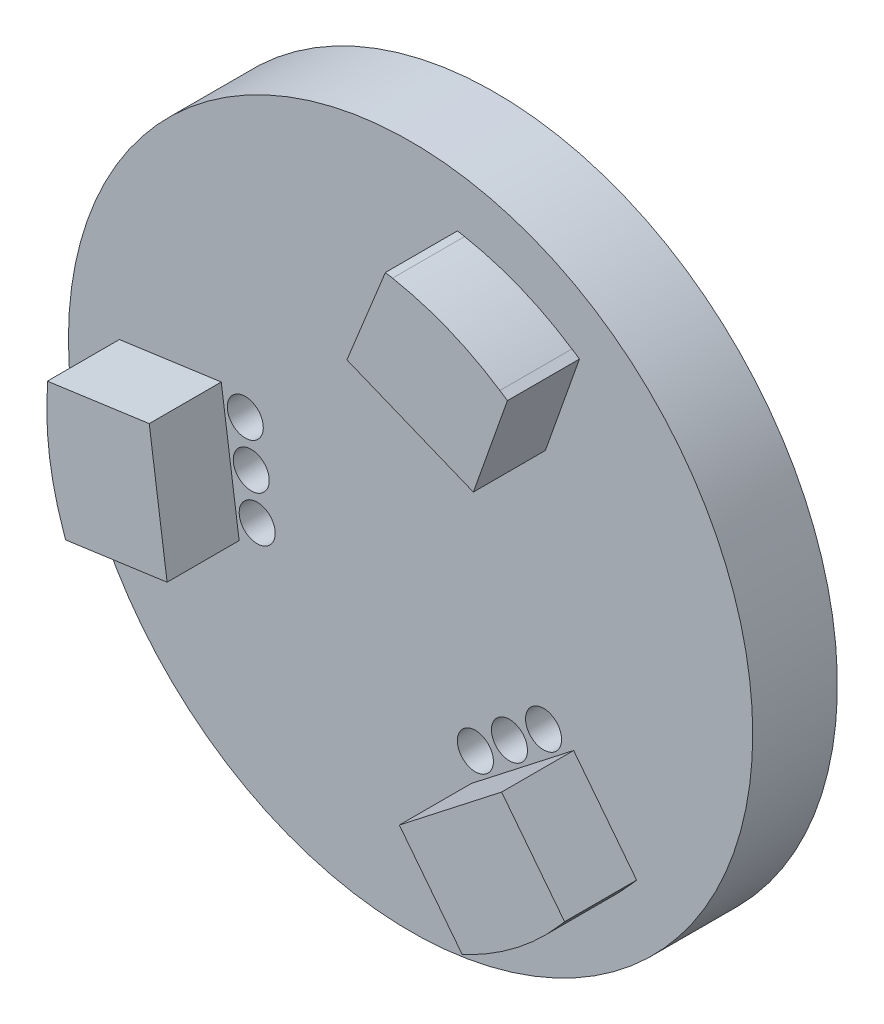
ISO-10303-21;
HEADER;
FILE_DESCRIPTION(('STEP AP214'),'2;1');
FILE_NAME('part.step','',(''),(''),'','','');
FILE_SCHEMA(('AUTOMOTIVE_DESIGN { 1 0 10303 214 1 1 1 1 }'));
ENDSEC;
DATA;
#1=APPLICATION_CONTEXT('core data for automotive mechanical design processes');
#2=APPLICATION_PROTOCOL_DEFINITION('international standard','automotive_design',2000,#1);
#3=PRODUCT_CONTEXT('',#1,'mechanical');
#4=PRODUCT('Part','Part','',(#3));
#5=PRODUCT_RELATED_PRODUCT_CATEGORY('part','',(#4));
#6=PRODUCT_DEFINITION_FORMATION('','',#4);
#7=PRODUCT_DEFINITION_CONTEXT('part definition',#1,'design');
#8=PRODUCT_DEFINITION('design','',#6,#7);
#9=PRODUCT_DEFINITION_SHAPE('','',#8);
#10=(LENGTH_UNIT() NAMED_UNIT(*) SI_UNIT(.MILLI.,.METRE.));
#11=(NAMED_UNIT(*) PLANE_ANGLE_UNIT() SI_UNIT($,.RADIAN.));
#12=(NAMED_UNIT(*) SI_UNIT($,.STERADIAN.) SOLID_ANGLE_UNIT());
#13=UNCERTAINTY_MEASURE_WITH_UNIT(LENGTH_MEASURE(1.E-05),#10,'distance_accuracy_value','');
#14=(GEOMETRIC_REPRESENTATION_CONTEXT(3) GLOBAL_UNCERTAINTY_ASSIGNED_CONTEXT((#13)) GLOBAL_UNIT_ASSIGNED_CONTEXT((#10,
#11,#12)) REPRESENTATION_CONTEXT('',''));
#15=CARTESIAN_POINT('',(0.,0.,0.));
#16=DIRECTION('',(0.,0.,1.));
#17=DIRECTION('',(1.,0.,0.));
#18=AXIS2_PLACEMENT_3D('',#15,#16,#17);
#19=CARTESIAN_POINT('',(0.,0.,3.));
#20=DIRECTION('',(0.,0.,-1.));
#21=DIRECTION('',(-1.,0.,0.));
#22=AXIS2_PLACEMENT_3D('',#19,#20,#21);
#23=CYLINDRICAL_SURFACE('',#22,9.5);
#24=CARTESIAN_POINT('',(0.,0.,3.));
#25=DIRECTION('',(0.,0.,1.));
#26=DIRECTION('',(1.,0.,0.));
#27=AXIS2_PLACEMENT_3D('',#24,#25,#26);
#28=CIRCLE('',#27,9.5);
#29=CARTESIAN_POINT('',(9.5,0.,3.));
#30=VERTEX_POINT('',#29);
#31=EDGE_CURVE('E48',#30,#30,#28,.T.);
#32=ORIENTED_EDGE('',*,*,#31,.F.);
#33=EDGE_LOOP('',(#32));
#34=FACE_BOUND('',#33,.T.);
#35=CARTESIAN_POINT('',(0.,0.,0.65));
#36=DIRECTION('',(0.,0.,-1.));
#37=DIRECTION('',(-1.,0.,0.));
#38=AXIS2_PLACEMENT_3D('',#35,#36,#37);
#39=CIRCLE('',#38,9.5);
#40=CARTESIAN_POINT('',(-9.5,0.,0.65));
#41=VERTEX_POINT('',#40);
#42=EDGE_CURVE('E328',#41,#41,#39,.T.);
#43=ORIENTED_EDGE('',*,*,#42,.F.);
#44=EDGE_LOOP('',(#43));
#45=FACE_BOUND('',#44,.T.);
#46=ADVANCED_FACE('F39',(#34,#45),#23,.T.);
#47=CARTESIAN_POINT('',(2.74536591683625,-3.52340293727328,0.));
#48=DIRECTION('',(0.,0.,1.));
#49=DIRECTION('',(1.,0.,0.));
#50=AXIS2_PLACEMENT_3D('',#47,#48,#49);
#51=CYLINDRICAL_SURFACE('',#50,0.5);
#52=CARTESIAN_POINT('',(2.74536591683625,-3.52340293727328,3.));
#53=DIRECTION('',(0.,0.,1.));
#54=DIRECTION('',(1.,0.,0.));
#55=AXIS2_PLACEMENT_3D('',#52,#53,#54);
#56=CIRCLE('',#55,0.5);
#57=CARTESIAN_POINT('',(3.24536591683625,-3.52340293727328,3.));
#58=VERTEX_POINT('',#57);
#59=EDGE_CURVE('E388',#58,#58,#56,.T.);
#60=ORIENTED_EDGE('',*,*,#59,.T.);
#61=EDGE_LOOP('',(#60));
#62=FACE_BOUND('',#61,.T.);
#63=CARTESIAN_POINT('',(2.74536591683625,-3.52340293727328,0.65));
#64=DIRECTION('',(0.,0.,-1.));
#65=DIRECTION('',(-1.,0.,0.));
#66=AXIS2_PLACEMENT_3D('',#63,#64,#65);
#67=CIRCLE('',#66,0.5);
#68=CARTESIAN_POINT('',(2.24536591683625,-3.52340293727328,0.65));
#69=VERTEX_POINT('',#68);
#70=EDGE_CURVE('E363',#69,#69,#67,.F.);
#71=ORIENTED_EDGE('',*,*,#70,.F.);
#72=EDGE_LOOP('',(#71));
#73=FACE_BOUND('',#72,.T.);
#74=ADVANCED_FACE('F325',(#62,#73),#51,.F.);
#75=CARTESIAN_POINT('',(2.79070486690902,3.6882744775196,0.));
#76=DIRECTION('',(0.,0.,1.));
#77=DIRECTION('',(1.,0.,0.));
#78=AXIS2_PLACEMENT_3D('',#75,#76,#77);
#79=CYLINDRICAL_SURFACE('',#78,0.5);
#80=CARTESIAN_POINT('',(2.79070486690902,3.6882744775196,3.));
#81=DIRECTION('',(0.,0.,1.));
#82=DIRECTION('',(1.,0.,0.));
#83=AXIS2_PLACEMENT_3D('',#80,#81,#82);
#84=CIRCLE('',#83,0.5);
#85=CARTESIAN_POINT('',(3.29070486690902,3.6882744775196,3.));
#86=VERTEX_POINT('',#85);
#87=EDGE_CURVE('E376',#86,#86,#84,.T.);
#88=ORIENTED_EDGE('',*,*,#87,.T.);
#89=EDGE_LOOP('',(#88));
#90=FACE_BOUND('',#89,.T.);
#91=CARTESIAN_POINT('',(2.79070486690902,3.6882744775196,0.65));
#92=DIRECTION('',(0.,0.,-1.));
#93=DIRECTION('',(-1.,0.,0.));
#94=AXIS2_PLACEMENT_3D('',#91,#92,#93);
#95=CIRCLE('',#94,0.5);
#96=CARTESIAN_POINT('',(2.29070486690902,3.6882744775196,0.65));
#97=VERTEX_POINT('',#96);
#98=EDGE_CURVE('E359',#97,#97,#95,.F.);
#99=ORIENTED_EDGE('',*,*,#98,.F.);
#100=EDGE_LOOP('',(#99));
#101=FACE_BOUND('',#100,.T.);
#102=ADVANCED_FACE('F555',(#90,#101),#79,.F.);
#103=CARTESIAN_POINT('',(-4.25858699261475,-1.8043943865033,0.));
#104=DIRECTION('',(0.,0.,1.));
#105=DIRECTION('',(1.,0.,0.));
#106=AXIS2_PLACEMENT_3D('',#103,#104,#105);
#107=CYLINDRICAL_SURFACE('',#106,0.499999999999999);
#108=CARTESIAN_POINT('',(-4.25858699261475,-1.8043943865033,3.));
#109=DIRECTION('',(0.,0.,1.));
#110=DIRECTION('',(-1.,0.,0.));
#111=AXIS2_PLACEMENT_3D('',#108,#109,#110);
#112=CIRCLE('',#111,0.499999999999999);
#113=CARTESIAN_POINT('',(-4.75858699261475,-1.8043943865033,3.));
#114=VERTEX_POINT('',#113);
#115=EDGE_CURVE('E372',#114,#114,#112,.T.);
#116=ORIENTED_EDGE('',*,*,#115,.T.);
#117=EDGE_LOOP('',(#116));
#118=FACE_BOUND('',#117,.T.);
#119=CARTESIAN_POINT('',(-4.25858699261475,-1.8043943865033,0.65));
#120=DIRECTION('',(0.,0.,-1.));
#121=DIRECTION('',(-1.,0.,0.));
#122=AXIS2_PLACEMENT_3D('',#119,#120,#121);
#123=CIRCLE('',#122,0.499999999999999);
#124=CARTESIAN_POINT('',(-4.75858699261475,-1.8043943865033,0.65));
#125=VERTEX_POINT('',#124);
#126=EDGE_CURVE('E355',#125,#125,#123,.F.);
#127=ORIENTED_EDGE('',*,*,#126,.F.);
#128=EDGE_LOOP('',(#127));
#129=FACE_BOUND('',#128,.T.);
#130=ADVANCED_FACE('F572',(#118,#129),#107,.F.);
#131=CARTESIAN_POINT('',(-4.4240394098655,-0.615855158027483,0.));
#132=DIRECTION('',(0.,0.,1.));
#133=DIRECTION('',(1.,0.,0.));
#134=AXIS2_PLACEMENT_3D('',#131,#132,#133);
#135=CYLINDRICAL_SURFACE('',#134,0.5);
#136=CARTESIAN_POINT('',(-4.4240394098655,-0.615855158027483,3.));
#137=DIRECTION('',(0.,0.,1.));
#138=DIRECTION('',(-1.,0.,0.));
#139=AXIS2_PLACEMENT_3D('',#136,#137,#138);
#140=CIRCLE('',#139,0.5);
#141=CARTESIAN_POINT('',(-4.9240394098655,-0.615855158027483,3.));
#142=VERTEX_POINT('',#141);
#143=EDGE_CURVE('E368',#142,#142,#140,.T.);
#144=ORIENTED_EDGE('',*,*,#143,.T.);
#145=EDGE_LOOP('',(#144));
#146=FACE_BOUND('',#145,.T.);
#147=CARTESIAN_POINT('',(-4.4240394098655,-0.615855158027483,0.65));
#148=DIRECTION('',(0.,0.,-1.));
#149=DIRECTION('',(-1.,0.,0.));
#150=AXIS2_PLACEMENT_3D('',#147,#148,#149);
#151=CIRCLE('',#150,0.5);
#152=CARTESIAN_POINT('',(-4.9240394098655,-0.615855158027483,0.65));
#153=VERTEX_POINT('',#152);
#154=EDGE_CURVE('E351',#153,#153,#151,.F.);
#155=ORIENTED_EDGE('',*,*,#154,.F.);
#156=EDGE_LOOP('',(#155));
#157=FACE_BOUND('',#156,.T.);
#158=ADVANCED_FACE('F568',(#146,#157),#135,.F.);
#159=CARTESIAN_POINT('',(-4.58949182711625,0.572684070448331,0.));
#160=DIRECTION('',(0.,0.,1.));
#161=DIRECTION('',(1.,0.,0.));
#162=AXIS2_PLACEMENT_3D('',#159,#160,#161);
#163=CYLINDRICAL_SURFACE('',#162,0.5);
#164=CARTESIAN_POINT('',(-4.58949182711625,0.572684070448331,3.));
#165=DIRECTION('',(0.,0.,1.));
#166=DIRECTION('',(1.,0.,0.));
#167=AXIS2_PLACEMENT_3D('',#164,#165,#166);
#168=CIRCLE('',#167,0.5);
#169=CARTESIAN_POINT('',(-4.08949182711625,0.572684070448331,3.));
#170=VERTEX_POINT('',#169);
#171=EDGE_CURVE('E367',#170,#170,#168,.T.);
#172=ORIENTED_EDGE('',*,*,#171,.T.);
#173=EDGE_LOOP('',(#172));
#174=FACE_BOUND('',#173,.T.);
#175=CARTESIAN_POINT('',(-4.58949182711625,0.572684070448331,0.65));
#176=DIRECTION('',(0.,0.,-1.));
#177=DIRECTION('',(-1.,0.,0.));
#178=AXIS2_PLACEMENT_3D('',#175,#176,#177);
#179=CIRCLE('',#178,0.5);
#180=CARTESIAN_POINT('',(-5.08949182711625,0.572684070448331,0.65));
#181=VERTEX_POINT('',#180);
#182=EDGE_CURVE('E347',#181,#181,#179,.F.);
#183=ORIENTED_EDGE('',*,*,#182,.F.);
#184=EDGE_LOOP('',(#183));
#185=FACE_BOUND('',#184,.T.);
#186=ADVANCED_FACE('F571',(#174,#185),#163,.F.);
#187=CARTESIAN_POINT('',(1.67867349302923,4.1392580953008,0.));
#188=DIRECTION('',(0.,0.,1.));
#189=DIRECTION('',(1.,0.,0.));
#190=AXIS2_PLACEMENT_3D('',#187,#188,#189);
#191=CYLINDRICAL_SURFACE('',#190,0.5);
#192=CARTESIAN_POINT('',(1.67867349302923,4.1392580953008,3.));
#193=DIRECTION('',(0.,0.,1.));
#194=DIRECTION('',(-1.,0.,0.));
#195=AXIS2_PLACEMENT_3D('',#192,#193,#194);
#196=CIRCLE('',#195,0.5);
#197=CARTESIAN_POINT('',(1.17867349302923,4.1392580953008,3.));
#198=VERTEX_POINT('',#197);
#199=EDGE_CURVE('E380',#198,#198,#196,.T.);
#200=ORIENTED_EDGE('',*,*,#199,.T.);
#201=EDGE_LOOP('',(#200));
#202=FACE_BOUND('',#201,.T.);
#203=CARTESIAN_POINT('',(1.67867349302923,4.1392580953008,0.65));
#204=DIRECTION('',(0.,0.,-1.));
#205=DIRECTION('',(-1.,0.,0.));
#206=AXIS2_PLACEMENT_3D('',#203,#204,#205);
#207=CIRCLE('',#206,0.5);
#208=CARTESIAN_POINT('',(1.17867349302923,4.1392580953008,0.65));
#209=VERTEX_POINT('',#208);
#210=EDGE_CURVE('E343',#209,#209,#207,.F.);
#211=ORIENTED_EDGE('',*,*,#210,.F.);
#212=EDGE_LOOP('',(#211));
#213=FACE_BOUND('',#212,.T.);
#214=ADVANCED_FACE('F576',(#202,#213),#191,.F.);
#215=CARTESIAN_POINT('',(0.566642119149436,4.590241713082,0.));
#216=DIRECTION('',(0.,0.,1.));
#217=DIRECTION('',(1.,0.,0.));
#218=AXIS2_PLACEMENT_3D('',#215,#216,#217);
#219=CYLINDRICAL_SURFACE('',#218,0.5);
#220=CARTESIAN_POINT('',(0.566642119149436,4.590241713082,3.));
#221=DIRECTION('',(0.,0.,1.));
#222=DIRECTION('',(-1.,0.,0.));
#223=AXIS2_PLACEMENT_3D('',#220,#221,#222);
#224=CIRCLE('',#223,0.5);
#225=CARTESIAN_POINT('',(0.0666421191494366,4.590241713082,3.));
#226=VERTEX_POINT('',#225);
#227=EDGE_CURVE('E393',#226,#226,#224,.T.);
#228=ORIENTED_EDGE('',*,*,#227,.T.);
#229=EDGE_LOOP('',(#228));
#230=FACE_BOUND('',#229,.T.);
#231=CARTESIAN_POINT('',(0.566642119149436,4.590241713082,0.65));
#232=DIRECTION('',(0.,0.,-1.));
#233=DIRECTION('',(-1.,0.,0.));
#234=AXIS2_PLACEMENT_3D('',#231,#232,#233);
#235=CIRCLE('',#234,0.5);
#236=CARTESIAN_POINT('',(0.0666421191494366,4.590241713082,0.65));
#237=VERTEX_POINT('',#236);
#238=EDGE_CURVE('E339',#237,#237,#235,.F.);
#239=ORIENTED_EDGE('',*,*,#238,.F.);
#240=EDGE_LOOP('',(#239));
#241=FACE_BOUND('',#240,.T.);
#242=ADVANCED_FACE('F586',(#230,#241),#219,.F.);
#243=CARTESIAN_POINT('',(3.69194487346528,-2.78584732657868,0.));
#244=DIRECTION('',(0.,0.,1.));
#245=DIRECTION('',(1.,0.,0.));
#246=AXIS2_PLACEMENT_3D('',#243,#244,#245);
#247=CYLINDRICAL_SURFACE('',#246,0.5);
#248=CARTESIAN_POINT('',(3.69194487346528,-2.78584732657868,3.));
#249=DIRECTION('',(0.,0.,1.));
#250=DIRECTION('',(-1.,0.,0.));
#251=AXIS2_PLACEMENT_3D('',#248,#249,#250);
#252=CIRCLE('',#251,0.5);
#253=CARTESIAN_POINT('',(3.19194487346528,-2.78584732657868,3.));
#254=VERTEX_POINT('',#253);
#255=EDGE_CURVE('E389',#254,#254,#252,.T.);
#256=ORIENTED_EDGE('',*,*,#255,.T.);
#257=EDGE_LOOP('',(#256));
#258=FACE_BOUND('',#257,.T.);
#259=CARTESIAN_POINT('',(3.69194487346528,-2.78584732657868,0.65));
#260=DIRECTION('',(0.,0.,-1.));
#261=DIRECTION('',(-1.,0.,0.));
#262=AXIS2_PLACEMENT_3D('',#259,#260,#261);
#263=CIRCLE('',#262,0.5);
#264=CARTESIAN_POINT('',(3.19194487346528,-2.78584732657868,0.65));
#265=VERTEX_POINT('',#264);
#266=EDGE_CURVE('E334',#265,#265,#263,.F.);
#267=ORIENTED_EDGE('',*,*,#266,.F.);
#268=EDGE_LOOP('',(#267));
#269=FACE_BOUND('',#268,.T.);
#270=ADVANCED_FACE('F532',(#258,#269),#247,.F.);
#271=CARTESIAN_POINT('',(1.79878696020721,-4.26095854796789,0.));
#272=DIRECTION('',(0.,0.,1.));
#273=DIRECTION('',(1.,0.,0.));
#274=AXIS2_PLACEMENT_3D('',#271,#272,#273);
#275=CYLINDRICAL_SURFACE('',#274,0.5);
#276=CARTESIAN_POINT('',(1.79878696020721,-4.26095854796789,3.));
#277=DIRECTION('',(0.,0.,1.));
#278=DIRECTION('',(1.,0.,0.));
#279=AXIS2_PLACEMENT_3D('',#276,#277,#278);
#280=CIRCLE('',#279,0.5);
#281=CARTESIAN_POINT('',(2.29878696020721,-4.26095854796789,3.));
#282=VERTEX_POINT('',#281);
#283=EDGE_CURVE('E384',#282,#282,#280,.T.);
#284=ORIENTED_EDGE('',*,*,#283,.T.);
#285=EDGE_LOOP('',(#284));
#286=FACE_BOUND('',#285,.T.);
#287=CARTESIAN_POINT('',(1.79878696020721,-4.26095854796789,0.65));
#288=DIRECTION('',(0.,0.,-1.));
#289=DIRECTION('',(-1.,0.,0.));
#290=AXIS2_PLACEMENT_3D('',#287,#288,#289);
#291=CIRCLE('',#290,0.5);
#292=CARTESIAN_POINT('',(1.29878696020721,-4.26095854796789,0.65));
#293=VERTEX_POINT('',#292);
#294=EDGE_CURVE('E42',#293,#293,#291,.F.);
#295=ORIENTED_EDGE('',*,*,#294,.F.);
#296=EDGE_LOOP('',(#295));
#297=FACE_BOUND('',#296,.T.);
#298=ADVANCED_FACE('F527',(#286,#297),#275,.F.);
#299=CARTESIAN_POINT('',(0.,0.,3.));
#300=DIRECTION('',(0.,0.,1.));
#301=DIRECTION('',(1.,0.,0.));
#302=AXIS2_PLACEMENT_3D('',#299,#300,#301);
#303=PLANE('',#302);
#304=ORIENTED_EDGE('',*,*,#283,.F.);
#305=EDGE_LOOP('',(#304));
#306=FACE_BOUND('',#305,.T.);
#307=ORIENTED_EDGE('',*,*,#255,.F.);
#308=EDGE_LOOP('',(#307));
#309=FACE_BOUND('',#308,.T.);
#310=ORIENTED_EDGE('',*,*,#227,.F.);
#311=EDGE_LOOP('',(#310));
#312=FACE_BOUND('',#311,.T.);
#313=ORIENTED_EDGE('',*,*,#199,.F.);
#314=EDGE_LOOP('',(#313));
#315=FACE_BOUND('',#314,.T.);
#316=ORIENTED_EDGE('',*,*,#171,.F.);
#317=EDGE_LOOP('',(#316));
#318=FACE_BOUND('',#317,.T.);
#319=ORIENTED_EDGE('',*,*,#143,.F.);
#320=EDGE_LOOP('',(#319));
#321=FACE_BOUND('',#320,.T.);
#322=ORIENTED_EDGE('',*,*,#115,.F.);
#323=EDGE_LOOP('',(#322));
#324=FACE_BOUND('',#323,.T.);
#325=ORIENTED_EDGE('',*,*,#87,.F.);
#326=EDGE_LOOP('',(#325));
#327=FACE_BOUND('',#326,.T.);
#328=ORIENTED_EDGE('',*,*,#59,.F.);
#329=EDGE_LOOP('',(#328));
#330=FACE_BOUND('',#329,.T.);
#331=DIRECTION('',(-0.990449357063178,-0.137877014375628,0.));
#332=VECTOR('',#331,1.);
#333=CARTESIAN_POINT('',(-8.08503436441291,0.691867379006932,3.));
#334=LINE('',#333,#332);
#335=CARTESIAN_POINT('',(-5.25633344815739,1.08564100722287,3.));
#336=VERTEX_POINT('',#335);
#337=CARTESIAN_POINT('',(-8.08503436441291,0.691867379006932,3.));
#338=VERTEX_POINT('',#337);
#339=EDGE_CURVE('E416',#336,#338,#334,.T.);
#340=ORIENTED_EDGE('',*,*,#339,.F.);
#341=DIRECTION('',(-0.137877014375627,0.990449357063178,0.));
#342=VECTOR('',#341,1.);
#343=CARTESIAN_POINT('',(-5.25633344815739,1.08564100722287,3.));
#344=LINE('',#343,#342);
#345=CARTESIAN_POINT('',(-4.75997619640513,-2.47997667820457,3.));
#346=VERTEX_POINT('',#345);
#347=EDGE_CURVE('E189',#346,#336,#344,.T.);
#348=ORIENTED_EDGE('',*,*,#347,.F.);
#349=DIRECTION('',(0.990449357063178,0.137877014375627,0.));
#350=VECTOR('',#349,1.);
#351=CARTESIAN_POINT('',(-4.75997619640513,-2.47997667820457,3.));
#352=LINE('',#351,#350);
#353=CARTESIAN_POINT('',(-7.57641635797556,-2.87204352935218,3.));
#354=VERTEX_POINT('',#353);
#355=EDGE_CURVE('E185',#354,#346,#352,.T.);
#356=ORIENTED_EDGE('',*,*,#355,.F.);
#357=DIRECTION('',(0.331065893774219,-0.943607637728456,0.));
#358=VECTOR('',#357,1.);
#359=CARTESIAN_POINT('',(-7.64322186560045,-2.68163373957129,3.));
#360=LINE('',#359,#358);
#361=CARTESIAN_POINT('',(-7.64322186560045,-2.68163373957129,3.));
#362=VERTEX_POINT('',#361);
#363=EDGE_CURVE('E425',#362,#354,#360,.T.);
#364=ORIENTED_EDGE('',*,*,#363,.F.);
#365=CARTESIAN_POINT('',(5.04804531509251E-13,0.,3.));
#366=DIRECTION('',(0.,0.,1.));
#367=DIRECTION('',(-1.,0.,0.));
#368=AXIS2_PLACEMENT_3D('',#365,#366,#367);
#369=CIRCLE('',#368,8.1000000000005);
#370=CARTESIAN_POINT('',(-8.08503436441291,0.492157826578429,3.));
#371=VERTEX_POINT('',#370);
#372=EDGE_CURVE('E422',#371,#362,#369,.T.);
#373=ORIENTED_EDGE('',*,*,#372,.F.);
#374=DIRECTION('',(0.,-1.,0.));
#375=VECTOR('',#374,1.);
#376=CARTESIAN_POINT('',(-8.08503436441291,0.492157826578429,3.));
#377=LINE('',#376,#375);
#378=EDGE_CURVE('E419',#338,#371,#377,.T.);
#379=ORIENTED_EDGE('',*,*,#378,.F.);
#380=EDGE_LOOP('',(#340,#348,#356,#364,#373,#379));
#381=FACE_BOUND('',#380,.T.);
#382=DIRECTION('',(-0.78881579719086,-0.614629675578838,0.));
#383=VECTOR('',#382,1.);
#384=CARTESIAN_POINT('',(4.52771090232068,-2.88227196839377,3.));
#385=LINE('',#384,#383);
#386=CARTESIAN_POINT('',(4.52771090232068,-2.88227196839377,3.));
#387=VERTEX_POINT('',#386);
#388=CARTESIAN_POINT('',(1.68797403243358,-5.09493880047758,3.));
#389=VERTEX_POINT('',#388);
#390=EDGE_CURVE('E11',#387,#389,#385,.T.);
#391=ORIENTED_EDGE('',*,*,#390,.F.);
#392=DIRECTION('',(-0.614629675578839,0.78881579719086,0.));
#393=VECTOR('',#392,1.);
#394=CARTESIAN_POINT('',(4.52771090232068,-2.88227196839377,3.));
#395=LINE('',#394,#393);
#396=CARTESIAN_POINT('',(6.27547083618151,-5.12534727097869,3.));
#397=VERTEX_POINT('',#396);
#398=EDGE_CURVE('E286',#397,#387,#395,.T.);
#399=ORIENTED_EDGE('',*,*,#398,.F.);
#400=DIRECTION('',(0.651655238590737,0.75851529319932,0.));
#401=VECTOR('',#400,1.);
#402=CARTESIAN_POINT('',(6.14397387491444,-5.27840743258502,3.));
#403=LINE('',#402,#401);
#404=CARTESIAN_POINT('',(6.14397387491444,-5.27840743258502,3.));
#405=VERTEX_POINT('',#404);
#406=EDGE_CURVE('E282',#405,#397,#403,.T.);
#407=ORIENTED_EDGE('',*,*,#406,.F.);
#408=CARTESIAN_POINT('',(0.,0.,3.));
#409=DIRECTION('',(0.,0.,1.));
#410=DIRECTION('',(-1.,0.,0.));
#411=AXIS2_PLACEMENT_3D('',#408,#409,#410);
#412=CIRCLE('',#411,8.09999999999994);
#413=CARTESIAN_POINT('',(3.61629600171824,-7.24792406334094,3.));
#414=VERTEX_POINT('',#413);
#415=EDGE_CURVE('E258',#414,#405,#412,.T.);
#416=ORIENTED_EDGE('',*,*,#415,.F.);
#417=DIRECTION('',(0.894805439918635,0.446456296508425,0.));
#418=VECTOR('',#417,1.);
#419=CARTESIAN_POINT('',(3.61629600171824,-7.24792406334094,3.));
#420=LINE('',#419,#418);
#421=CARTESIAN_POINT('',(3.43573396629442,-7.33801410306251,3.));
#422=VERTEX_POINT('',#421);
#423=EDGE_CURVE('E60',#422,#414,#420,.T.);
#424=ORIENTED_EDGE('',*,*,#423,.F.);
#425=DIRECTION('',(0.614629675578838,-0.78881579719086,0.));
#426=VECTOR('',#425,1.);
#427=CARTESIAN_POINT('',(1.68797403243358,-5.09493880047758,3.));
#428=LINE('',#427,#426);
#429=EDGE_CURVE('E56',#389,#422,#428,.T.);
#430=ORIENTED_EDGE('',*,*,#429,.F.);
#431=EDGE_LOOP('',(#391,#399,#407,#416,#424,#430));
#432=FACE_BOUND('',#431,.T.);
#433=ORIENTED_EDGE('',*,*,#31,.T.);
#434=EDGE_LOOP('',(#433));
#435=FACE_BOUND('',#434,.T.);
#436=DIRECTION('',(0.333710036973058,0.942675772057095,0.));
#437=VECTOR('',#436,1.);
#438=CARTESIAN_POINT('',(3.74280664353359,3.93855083075217,3.));
#439=LINE('',#438,#437);
#440=CARTESIAN_POINT('',(3.74280664353359,3.93855083075217,3.));
#441=VERTEX_POINT('',#440);
#442=CARTESIAN_POINT('',(4.6884799904159,6.60992194224821,3.));
#443=VERTEX_POINT('',#442);
#444=EDGE_CURVE('E231',#441,#443,#439,.T.);
#445=ORIENTED_EDGE('',*,*,#444,.F.);
#446=DIRECTION('',(0.926692811566493,-0.375819681484335,0.));
#447=VECTOR('',#446,1.);
#448=CARTESIAN_POINT('',(0.232265294084412,5.36224864659836,3.));
#449=LINE('',#448,#447);
#450=CARTESIAN_POINT('',(0.232265294084412,5.36224864659836,3.));
#451=VERTEX_POINT('',#450);
#452=EDGE_CURVE('E228',#451,#441,#449,.T.);
#453=ORIENTED_EDGE('',*,*,#452,.F.);
#454=DIRECTION('',(-0.375819681484335,-0.926692811566494,0.));
#455=VECTOR('',#454,1.);
#456=CARTESIAN_POINT('',(0.232265294084412,5.36224864659836,3.));
#457=LINE('',#456,#455);
#458=CARTESIAN_POINT('',(1.300945521794,7.99739080033092,3.));
#459=VERTEX_POINT('',#458);
#460=EDGE_CURVE('E225',#459,#451,#457,.T.);
#461=ORIENTED_EDGE('',*,*,#460,.F.);
#462=DIRECTION('',(-0.982721132364978,0.185092344529143,0.));
#463=VECTOR('',#462,1.);
#464=CARTESIAN_POINT('',(1.49924799068596,7.96004117215634,3.));
#465=LINE('',#464,#463);
#466=CARTESIAN_POINT('',(1.49924799068596,7.96004117215634,3.));
#467=VERTEX_POINT('',#466);
#468=EDGE_CURVE('E196',#467,#459,#465,.T.);
#469=ORIENTED_EDGE('',*,*,#468,.F.);
#470=CARTESIAN_POINT('',(0.,-2.28983498828939E-13,3.));
#471=DIRECTION('',(0.,0.,1.));
#472=DIRECTION('',(-1.,0.,0.));
#473=AXIS2_PLACEMENT_3D('',#470,#471,#472);
#474=CIRCLE('',#473,8.10000000000024);
#475=CARTESIAN_POINT('',(4.47950225270787,6.74863390383455,3.));
#476=VERTEX_POINT('',#475);
#477=EDGE_CURVE('E191',#476,#467,#474,.T.);
#478=ORIENTED_EDGE('',*,*,#477,.F.);
#479=DIRECTION('',(-0.833164679485751,0.5530249694701,0.));
#480=VECTOR('',#479,1.);
#481=CARTESIAN_POINT('',(4.47950225270787,6.74863390383455,3.));
#482=LINE('',#481,#480);
#483=EDGE_CURVE('E207',#443,#476,#482,.T.);
#484=ORIENTED_EDGE('',*,*,#483,.F.);
#485=EDGE_LOOP('',(#445,#453,#461,#469,#478,#484));
#486=FACE_BOUND('',#485,.T.);
#487=ADVANCED_FACE('F320',(#306,#309,#312,#315,#318,#321,#324,#327,#330,#381,#432,#435,#486),
#303,.T.);
#488=CARTESIAN_POINT('',(0.,0.,5.));
#489=DIRECTION('',(0.,0.,-1.));
#490=DIRECTION('',(-1.,0.,0.));
#491=AXIS2_PLACEMENT_3D('',#488,#489,#490);
#492=CYLINDRICAL_SURFACE('',#491,8.09999999999994);
#493=ORIENTED_EDGE('',*,*,#415,.T.);
#494=DIRECTION('',(0.,0.,-1.));
#495=VECTOR('',#494,1.);
#496=CARTESIAN_POINT('',(6.14397387491444,-5.27840743258502,5.));
#497=LINE('',#496,#495);
#498=CARTESIAN_POINT('',(6.14397387491444,-5.27840743258502,5.));
#499=VERTEX_POINT('',#498);
#500=EDGE_CURVE('E313',#499,#405,#497,.T.);
#501=ORIENTED_EDGE('',*,*,#500,.F.);
#502=CARTESIAN_POINT('',(0.,0.,5.));
#503=DIRECTION('',(0.,0.,1.));
#504=DIRECTION('',(-1.,0.,0.));
#505=AXIS2_PLACEMENT_3D('',#502,#503,#504);
#506=CIRCLE('',#505,8.09999999999994);
#507=CARTESIAN_POINT('',(3.61629600171824,-7.24792406334094,5.));
#508=VERTEX_POINT('',#507);
#509=EDGE_CURVE('E259',#508,#499,#506,.T.);
#510=ORIENTED_EDGE('',*,*,#509,.F.);
#511=DIRECTION('',(0.,0.,-1.));
#512=VECTOR('',#511,1.);
#513=CARTESIAN_POINT('',(3.61629600171824,-7.24792406334094,5.));
#514=LINE('',#513,#512);
#515=EDGE_CURVE('E278',#508,#414,#514,.T.);
#516=ORIENTED_EDGE('',*,*,#515,.T.);
#517=EDGE_LOOP('',(#493,#501,#510,#516));
#518=FACE_BOUND('',#517,.T.);
#519=ADVANCED_FACE('F522',(#518),#492,.T.);
#520=CARTESIAN_POINT('',(6.14397387491444,-5.27840743258502,5.));
#521=DIRECTION('',(-0.75851529319932,0.651655238590737,0.));
#522=DIRECTION('',(-0.651655238590737,-0.75851529319932,0.));
#523=AXIS2_PLACEMENT_3D('',#520,#521,#522);
#524=PLANE('',#523);
#525=ORIENTED_EDGE('',*,*,#406,.T.);
#526=DIRECTION('',(0.,0.,-1.));
#527=VECTOR('',#526,1.);
#528=CARTESIAN_POINT('',(6.27547083618151,-5.12534727097869,5.));
#529=LINE('',#528,#527);
#530=CARTESIAN_POINT('',(6.27547083618151,-5.12534727097869,5.));
#531=VERTEX_POINT('',#530);
#532=EDGE_CURVE('E309',#531,#397,#529,.T.);
#533=ORIENTED_EDGE('',*,*,#532,.F.);
#534=DIRECTION('',(0.651655238590737,0.75851529319932,0.));
#535=VECTOR('',#534,1.);
#536=CARTESIAN_POINT('',(6.14397387491444,-5.27840743258502,5.));
#537=LINE('',#536,#535);
#538=EDGE_CURVE('E263',#499,#531,#537,.T.);
#539=ORIENTED_EDGE('',*,*,#538,.F.);
#540=ORIENTED_EDGE('',*,*,#500,.T.);
#541=EDGE_LOOP('',(#525,#533,#539,#540));
#542=FACE_BOUND('',#541,.T.);
#543=ADVANCED_FACE('F518',(#542),#524,.F.);
#544=CARTESIAN_POINT('',(4.52771090232068,-2.88227196839377,5.));
#545=DIRECTION('',(-0.78881579719086,-0.614629675578839,0.));
#546=DIRECTION('',(0.614629675578838,-0.78881579719086,0.));
#547=AXIS2_PLACEMENT_3D('',#544,#545,#546);
#548=PLANE('',#547);
#549=ORIENTED_EDGE('',*,*,#398,.T.);
#550=DIRECTION('',(0.,0.,-1.));
#551=VECTOR('',#550,1.);
#552=CARTESIAN_POINT('',(4.52771090232068,-2.88227196839377,5.));
#553=LINE('',#552,#551);
#554=CARTESIAN_POINT('',(4.52771090232068,-2.88227196839377,5.));
#555=VERTEX_POINT('',#554);
#556=EDGE_CURVE('E305',#555,#387,#553,.T.);
#557=ORIENTED_EDGE('',*,*,#556,.F.);
#558=DIRECTION('',(-0.614629675578839,0.78881579719086,0.));
#559=VECTOR('',#558,1.);
#560=CARTESIAN_POINT('',(4.52771090232068,-2.88227196839377,5.));
#561=LINE('',#560,#559);
#562=EDGE_CURVE('E266',#531,#555,#561,.T.);
#563=ORIENTED_EDGE('',*,*,#562,.F.);
#564=ORIENTED_EDGE('',*,*,#532,.T.);
#565=EDGE_LOOP('',(#549,#557,#563,#564));
#566=FACE_BOUND('',#565,.T.);
#567=ADVANCED_FACE('F514',(#566),#548,.F.);
#568=CARTESIAN_POINT('',(4.52771090232068,-2.88227196839377,5.));
#569=DIRECTION('',(0.614629675578838,-0.78881579719086,0.));
#570=DIRECTION('',(0.788815797190861,0.614629675578838,0.));
#571=AXIS2_PLACEMENT_3D('',#568,#569,#570);
#572=PLANE('',#571);
#573=ORIENTED_EDGE('',*,*,#556,.T.);
#574=ORIENTED_EDGE('',*,*,#390,.T.);
#575=DIRECTION('',(0.,0.,-1.));
#576=VECTOR('',#575,1.);
#577=CARTESIAN_POINT('',(1.68797403243358,-5.09493880047758,5.));
#578=LINE('',#577,#576);
#579=CARTESIAN_POINT('',(1.68797403243358,-5.09493880047758,5.));
#580=VERTEX_POINT('',#579);
#581=EDGE_CURVE('E301',#580,#389,#578,.T.);
#582=ORIENTED_EDGE('',*,*,#581,.F.);
#583=DIRECTION('',(-0.78881579719086,-0.614629675578838,0.));
#584=VECTOR('',#583,1.);
#585=CARTESIAN_POINT('',(4.52771090232068,-2.88227196839377,5.));
#586=LINE('',#585,#584);
#587=EDGE_CURVE('E269',#555,#580,#586,.T.);
#588=ORIENTED_EDGE('',*,*,#587,.F.);
#589=EDGE_LOOP('',(#573,#574,#582,#588));
#590=FACE_BOUND('',#589,.T.);
#591=ADVANCED_FACE('F510',(#590),#572,.F.);
#592=CARTESIAN_POINT('',(1.68797403243358,-5.09493880047758,5.));
#593=DIRECTION('',(0.78881579719086,0.614629675578838,0.));
#594=DIRECTION('',(-0.614629675578838,0.78881579719086,0.));
#595=AXIS2_PLACEMENT_3D('',#592,#593,#594);
#596=PLANE('',#595);
#597=ORIENTED_EDGE('',*,*,#429,.T.);
#598=DIRECTION('',(0.,0.,-1.));
#599=VECTOR('',#598,1.);
#600=CARTESIAN_POINT('',(3.43573396629442,-7.33801410306251,5.));
#601=LINE('',#600,#599);
#602=CARTESIAN_POINT('',(3.43573396629442,-7.33801410306251,5.));
#603=VERTEX_POINT('',#602);
#604=EDGE_CURVE('E297',#603,#422,#601,.T.);
#605=ORIENTED_EDGE('',*,*,#604,.F.);
#606=DIRECTION('',(0.614629675578838,-0.78881579719086,0.));
#607=VECTOR('',#606,1.);
#608=CARTESIAN_POINT('',(1.68797403243358,-5.09493880047758,5.));
#609=LINE('',#608,#607);
#610=EDGE_CURVE('E272',#580,#603,#609,.T.);
#611=ORIENTED_EDGE('',*,*,#610,.F.);
#612=ORIENTED_EDGE('',*,*,#581,.T.);
#613=EDGE_LOOP('',(#597,#605,#611,#612));
#614=FACE_BOUND('',#613,.T.);
#615=ADVANCED_FACE('F506',(#614),#596,.F.);
#616=CARTESIAN_POINT('',(3.61629600171824,-7.24792406334094,5.));
#617=DIRECTION('',(-0.446456296508425,0.894805439918635,0.));
#618=DIRECTION('',(-0.894805439918635,-0.446456296508425,0.));
#619=AXIS2_PLACEMENT_3D('',#616,#617,#618);
#620=PLANE('',#619);
#621=ORIENTED_EDGE('',*,*,#423,.T.);
#622=ORIENTED_EDGE('',*,*,#515,.F.);
#623=DIRECTION('',(0.894805439918635,0.446456296508425,0.));
#624=VECTOR('',#623,1.);
#625=CARTESIAN_POINT('',(3.61629600171824,-7.24792406334094,5.));
#626=LINE('',#625,#624);
#627=EDGE_CURVE('E275',#603,#508,#626,.T.);
#628=ORIENTED_EDGE('',*,*,#627,.F.);
#629=ORIENTED_EDGE('',*,*,#604,.T.);
#630=EDGE_LOOP('',(#621,#622,#628,#629));
#631=FACE_BOUND('',#630,.T.);
#632=ADVANCED_FACE('F502',(#631),#620,.F.);
#633=CARTESIAN_POINT('',(0.,0.,5.));
#634=DIRECTION('',(0.,0.,-1.));
#635=DIRECTION('',(-1.,0.,0.));
#636=AXIS2_PLACEMENT_3D('',#633,#634,#635);
#637=PLANE('',#636);
#638=ORIENTED_EDGE('',*,*,#509,.T.);
#639=ORIENTED_EDGE('',*,*,#538,.T.);
#640=ORIENTED_EDGE('',*,*,#562,.T.);
#641=ORIENTED_EDGE('',*,*,#587,.T.);
#642=ORIENTED_EDGE('',*,*,#610,.T.);
#643=ORIENTED_EDGE('',*,*,#627,.T.);
#644=EDGE_LOOP('',(#638,#639,#640,#641,#642,#643));
#645=FACE_BOUND('',#644,.T.);
#646=ADVANCED_FACE('F498',(#645),#637,.F.);
#647=CARTESIAN_POINT('',(0.,-2.28983498828939E-13,5.));
#648=DIRECTION('',(0.,0.,-1.));
#649=DIRECTION('',(-1.,0.,0.));
#650=AXIS2_PLACEMENT_3D('',#647,#648,#649);
#651=CYLINDRICAL_SURFACE('',#650,8.10000000000024);
#652=ORIENTED_EDGE('',*,*,#477,.T.);
#653=DIRECTION('',(0.,0.,-1.));
#654=VECTOR('',#653,1.);
#655=CARTESIAN_POINT('',(1.49924799068596,7.96004117215634,5.));
#656=LINE('',#655,#654);
#657=CARTESIAN_POINT('',(1.49924799068596,7.96004117215634,5.));
#658=VERTEX_POINT('',#657);
#659=EDGE_CURVE('E255',#658,#467,#656,.T.);
#660=ORIENTED_EDGE('',*,*,#659,.F.);
#661=CARTESIAN_POINT('',(0.,-2.28983498828939E-13,5.));
#662=DIRECTION('',(0.,0.,1.));
#663=DIRECTION('',(-1.,0.,0.));
#664=AXIS2_PLACEMENT_3D('',#661,#662,#663);
#665=CIRCLE('',#664,8.10000000000024);
#666=CARTESIAN_POINT('',(4.47950225270787,6.74863390383455,5.));
#667=VERTEX_POINT('',#666);
#668=EDGE_CURVE('E202',#667,#658,#665,.T.);
#669=ORIENTED_EDGE('',*,*,#668,.F.);
#670=DIRECTION('',(0.,0.,-1.));
#671=VECTOR('',#670,1.);
#672=CARTESIAN_POINT('',(4.47950225270787,6.74863390383455,5.));
#673=LINE('',#672,#671);
#674=EDGE_CURVE('E221',#667,#476,#673,.T.);
#675=ORIENTED_EDGE('',*,*,#674,.T.);
#676=EDGE_LOOP('',(#652,#660,#669,#675));
#677=FACE_BOUND('',#676,.T.);
#678=ADVANCED_FACE('F494',(#677),#651,.T.);
#679=CARTESIAN_POINT('',(1.49924799068596,7.96004117215634,5.));
#680=DIRECTION('',(-0.185092344529143,-0.982721132364978,0.));
#681=DIRECTION('',(0.982721132364978,-0.185092344529143,0.));
#682=AXIS2_PLACEMENT_3D('',#679,#680,#681);
#683=PLANE('',#682);
#684=ORIENTED_EDGE('',*,*,#468,.T.);
#685=DIRECTION('',(0.,0.,-1.));
#686=VECTOR('',#685,1.);
#687=CARTESIAN_POINT('',(1.300945521794,7.99739080033092,5.));
#688=LINE('',#687,#686);
#689=CARTESIAN_POINT('',(1.300945521794,7.99739080033092,5.));
#690=VERTEX_POINT('',#689);
#691=EDGE_CURVE('E251',#690,#459,#688,.T.);
#692=ORIENTED_EDGE('',*,*,#691,.F.);
#693=DIRECTION('',(-0.982721132364978,0.185092344529143,0.));
#694=VECTOR('',#693,1.);
#695=CARTESIAN_POINT('',(1.49924799068596,7.96004117215634,5.));
#696=LINE('',#695,#694);
#697=EDGE_CURVE('E206',#658,#690,#696,.T.);
#698=ORIENTED_EDGE('',*,*,#697,.F.);
#699=ORIENTED_EDGE('',*,*,#659,.T.);
#700=EDGE_LOOP('',(#684,#692,#698,#699));
#701=FACE_BOUND('',#700,.T.);
#702=ADVANCED_FACE('F490',(#701),#683,.F.);
#703=CARTESIAN_POINT('',(0.232265294084412,5.36224864659836,5.));
#704=DIRECTION('',(0.926692811566494,-0.375819681484335,0.));
#705=DIRECTION('',(0.375819681484335,0.926692811566494,0.));
#706=AXIS2_PLACEMENT_3D('',#703,#704,#705);
#707=PLANE('',#706);
#708=ORIENTED_EDGE('',*,*,#460,.T.);
#709=DIRECTION('',(0.,0.,-1.));
#710=VECTOR('',#709,1.);
#711=CARTESIAN_POINT('',(0.232265294084412,5.36224864659836,5.));
#712=LINE('',#711,#710);
#713=CARTESIAN_POINT('',(0.232265294084412,5.36224864659836,5.));
#714=VERTEX_POINT('',#713);
#715=EDGE_CURVE('E247',#714,#451,#712,.T.);
#716=ORIENTED_EDGE('',*,*,#715,.F.);
#717=DIRECTION('',(-0.375819681484335,-0.926692811566494,0.));
#718=VECTOR('',#717,1.);
#719=CARTESIAN_POINT('',(0.232265294084412,5.36224864659836,5.));
#720=LINE('',#719,#718);
#721=EDGE_CURVE('E210',#690,#714,#720,.T.);
#722=ORIENTED_EDGE('',*,*,#721,.F.);
#723=ORIENTED_EDGE('',*,*,#691,.T.);
#724=EDGE_LOOP('',(#708,#716,#722,#723));
#725=FACE_BOUND('',#724,.T.);
#726=ADVANCED_FACE('F486',(#725),#707,.F.);
#727=CARTESIAN_POINT('',(0.232265294084412,5.36224864659836,5.));
#728=DIRECTION('',(0.375819681484335,0.926692811566494,0.));
#729=DIRECTION('',(-0.926692811566494,0.375819681484335,0.));
#730=AXIS2_PLACEMENT_3D('',#727,#728,#729);
#731=PLANE('',#730);
#732=ORIENTED_EDGE('',*,*,#452,.T.);
#733=DIRECTION('',(0.,0.,-1.));
#734=VECTOR('',#733,1.);
#735=CARTESIAN_POINT('',(3.74280664353359,3.93855083075217,5.));
#736=LINE('',#735,#734);
#737=CARTESIAN_POINT('',(3.74280664353359,3.93855083075217,5.));
#738=VERTEX_POINT('',#737);
#739=EDGE_CURVE('E243',#738,#441,#736,.T.);
#740=ORIENTED_EDGE('',*,*,#739,.F.);
#741=DIRECTION('',(0.926692811566493,-0.375819681484335,0.));
#742=VECTOR('',#741,1.);
#743=CARTESIAN_POINT('',(0.232265294084412,5.36224864659836,5.));
#744=LINE('',#743,#742);
#745=EDGE_CURVE('E213',#714,#738,#744,.T.);
#746=ORIENTED_EDGE('',*,*,#745,.F.);
#747=ORIENTED_EDGE('',*,*,#715,.T.);
#748=EDGE_LOOP('',(#732,#740,#746,#747));
#749=FACE_BOUND('',#748,.T.);
#750=ADVANCED_FACE('F482',(#749),#731,.F.);
#751=CARTESIAN_POINT('',(3.74280664353359,3.93855083075217,5.));
#752=DIRECTION('',(-0.942675772057095,0.333710036973058,0.));
#753=DIRECTION('',(-0.333710036973058,-0.942675772057095,0.));
#754=AXIS2_PLACEMENT_3D('',#751,#752,#753);
#755=PLANE('',#754);
#756=ORIENTED_EDGE('',*,*,#444,.T.);
#757=DIRECTION('',(0.,0.,-1.));
#758=VECTOR('',#757,1.);
#759=CARTESIAN_POINT('',(4.6884799904159,6.60992194224821,5.));
#760=LINE('',#759,#758);
#761=CARTESIAN_POINT('',(4.6884799904159,6.60992194224821,5.));
#762=VERTEX_POINT('',#761);
#763=EDGE_CURVE('E239',#762,#443,#760,.T.);
#764=ORIENTED_EDGE('',*,*,#763,.F.);
#765=DIRECTION('',(0.333710036973058,0.942675772057095,0.));
#766=VECTOR('',#765,1.);
#767=CARTESIAN_POINT('',(3.74280664353359,3.93855083075217,5.));
#768=LINE('',#767,#766);
#769=EDGE_CURVE('E216',#738,#762,#768,.T.);
#770=ORIENTED_EDGE('',*,*,#769,.F.);
#771=ORIENTED_EDGE('',*,*,#739,.T.);
#772=EDGE_LOOP('',(#756,#764,#770,#771));
#773=FACE_BOUND('',#772,.T.);
#774=ADVANCED_FACE('F478',(#773),#755,.F.);
#775=CARTESIAN_POINT('',(4.47950225270787,6.74863390383455,5.));
#776=DIRECTION('',(-0.5530249694701,-0.833164679485751,0.));
#777=DIRECTION('',(0.833164679485751,-0.5530249694701,0.));
#778=AXIS2_PLACEMENT_3D('',#775,#776,#777);
#779=PLANE('',#778);
#780=ORIENTED_EDGE('',*,*,#483,.T.);
#781=ORIENTED_EDGE('',*,*,#674,.F.);
#782=DIRECTION('',(-0.833164679485751,0.5530249694701,0.));
#783=VECTOR('',#782,1.);
#784=CARTESIAN_POINT('',(4.47950225270787,6.74863390383455,5.));
#785=LINE('',#784,#783);
#786=EDGE_CURVE('E219',#762,#667,#785,.T.);
#787=ORIENTED_EDGE('',*,*,#786,.F.);
#788=ORIENTED_EDGE('',*,*,#763,.T.);
#789=EDGE_LOOP('',(#780,#781,#787,#788));
#790=FACE_BOUND('',#789,.T.);
#791=ADVANCED_FACE('F474',(#790),#779,.F.);
#792=CARTESIAN_POINT('',(0.,-2.28983498828939E-13,5.));
#793=DIRECTION('',(0.,0.,-1.));
#794=DIRECTION('',(-1.,0.,0.));
#795=AXIS2_PLACEMENT_3D('',#792,#793,#794);
#796=PLANE('',#795);
#797=ORIENTED_EDGE('',*,*,#668,.T.);
#798=ORIENTED_EDGE('',*,*,#697,.T.);
#799=ORIENTED_EDGE('',*,*,#721,.T.);
#800=ORIENTED_EDGE('',*,*,#745,.T.);
#801=ORIENTED_EDGE('',*,*,#769,.T.);
#802=ORIENTED_EDGE('',*,*,#786,.T.);
#803=EDGE_LOOP('',(#797,#798,#799,#800,#801,#802));
#804=FACE_BOUND('',#803,.T.);
#805=ADVANCED_FACE('F471',(#804),#796,.F.);
#806=CARTESIAN_POINT('',(-5.25633344815739,1.08564100722287,5.));
#807=DIRECTION('',(-0.990449357063178,-0.137877014375627,0.));
#808=DIRECTION('',(0.137877014375627,-0.990449357063178,0.));
#809=AXIS2_PLACEMENT_3D('',#806,#807,#808);
#810=PLANE('',#809);
#811=ORIENTED_EDGE('',*,*,#347,.T.);
#812=DIRECTION('',(0.,0.,-1.));
#813=VECTOR('',#812,1.);
#814=CARTESIAN_POINT('',(-5.25633344815739,1.08564100722287,5.));
#815=LINE('',#814,#813);
#816=CARTESIAN_POINT('',(-5.25633344815739,1.08564100722287,5.));
#817=VERTEX_POINT('',#816);
#818=EDGE_CURVE('E167',#817,#336,#815,.T.);
#819=ORIENTED_EDGE('',*,*,#818,.F.);
#820=DIRECTION('',(-0.137877014375627,0.990449357063178,0.));
#821=VECTOR('',#820,1.);
#822=CARTESIAN_POINT('',(-5.25633344815739,1.08564100722287,5.));
#823=LINE('',#822,#821);
#824=CARTESIAN_POINT('',(-4.75997619640513,-2.47997667820457,5.));
#825=VERTEX_POINT('',#824);
#826=EDGE_CURVE('E175',#825,#817,#823,.T.);
#827=ORIENTED_EDGE('',*,*,#826,.F.);
#828=DIRECTION('',(0.,0.,-1.));
#829=VECTOR('',#828,1.);
#830=CARTESIAN_POINT('',(-4.75997619640513,-2.47997667820457,5.));
#831=LINE('',#830,#829);
#832=EDGE_CURVE('E413',#825,#346,#831,.T.);
#833=ORIENTED_EDGE('',*,*,#832,.T.);
#834=EDGE_LOOP('',(#811,#819,#827,#833));
#835=FACE_BOUND('',#834,.T.);
#836=ADVANCED_FACE('F187',(#835),#810,.F.);
#837=CARTESIAN_POINT('',(-8.08503436441291,0.691867379006932,5.));
#838=DIRECTION('',(0.137877014375628,-0.990449357063178,0.));
#839=DIRECTION('',(0.990449357063178,0.137877014375628,0.));
#840=AXIS2_PLACEMENT_3D('',#837,#838,#839);
#841=PLANE('',#840);
#842=ORIENTED_EDGE('',*,*,#339,.T.);
#843=DIRECTION('',(0.,0.,-1.));
#844=VECTOR('',#843,1.);
#845=CARTESIAN_POINT('',(-8.08503436441291,0.691867379006932,5.));
#846=LINE('',#845,#844);
#847=CARTESIAN_POINT('',(-8.08503436441291,0.691867379006932,5.));
#848=VERTEX_POINT('',#847);
#849=EDGE_CURVE('E170',#848,#338,#846,.T.);
#850=ORIENTED_EDGE('',*,*,#849,.F.);
#851=DIRECTION('',(-0.990449357063178,-0.137877014375628,0.));
#852=VECTOR('',#851,1.);
#853=CARTESIAN_POINT('',(-8.08503436441291,0.691867379006932,5.));
#854=LINE('',#853,#852);
#855=EDGE_CURVE('E163',#817,#848,#854,.T.);
#856=ORIENTED_EDGE('',*,*,#855,.F.);
#857=ORIENTED_EDGE('',*,*,#818,.T.);
#858=EDGE_LOOP('',(#842,#850,#856,#857));
#859=FACE_BOUND('',#858,.T.);
#860=ADVANCED_FACE('F165',(#859),#841,.F.);
#861=CARTESIAN_POINT('',(-8.08503436441291,0.492157826578429,5.));
#862=DIRECTION('',(1.,0.,0.));
#863=DIRECTION('',(0.,0.,-1.));
#864=AXIS2_PLACEMENT_3D('',#861,#862,#863);
#865=PLANE('',#864);
#866=ORIENTED_EDGE('',*,*,#378,.T.);
#867=DIRECTION('',(0.,0.,-1.));
#868=VECTOR('',#867,1.);
#869=CARTESIAN_POINT('',(-8.08503436441291,0.492157826578429,5.));
#870=LINE('',#869,#868);
#871=CARTESIAN_POINT('',(-8.08503436441291,0.492157826578429,5.));
#872=VERTEX_POINT('',#871);
#873=EDGE_CURVE('E198',#872,#371,#870,.T.);
#874=ORIENTED_EDGE('',*,*,#873,.F.);
#875=DIRECTION('',(0.,-1.,0.));
#876=VECTOR('',#875,1.);
#877=CARTESIAN_POINT('',(-8.08503436441291,0.492157826578429,5.));
#878=LINE('',#877,#876);
#879=EDGE_CURVE('E174',#848,#872,#878,.T.);
#880=ORIENTED_EDGE('',*,*,#879,.F.);
#881=ORIENTED_EDGE('',*,*,#849,.T.);
#882=EDGE_LOOP('',(#866,#874,#880,#881));
#883=FACE_BOUND('',#882,.T.);
#884=ADVANCED_FACE('F458',(#883),#865,.F.);
#885=CARTESIAN_POINT('',(5.04804531509251E-13,0.,5.));
#886=DIRECTION('',(0.,0.,-1.));
#887=DIRECTION('',(-1.,0.,0.));
#888=AXIS2_PLACEMENT_3D('',#885,#886,#887);
#889=CYLINDRICAL_SURFACE('',#888,8.1000000000005);
#890=ORIENTED_EDGE('',*,*,#372,.T.);
#891=DIRECTION('',(0.,0.,-1.));
#892=VECTOR('',#891,1.);
#893=CARTESIAN_POINT('',(-7.64322186560045,-2.68163373957129,5.));
#894=LINE('',#893,#892);
#895=CARTESIAN_POINT('',(-7.64322186560045,-2.68163373957129,5.));
#896=VERTEX_POINT('',#895);
#897=EDGE_CURVE('E436',#896,#362,#894,.T.);
#898=ORIENTED_EDGE('',*,*,#897,.F.);
#899=CARTESIAN_POINT('',(5.04804531509251E-13,0.,5.));
#900=DIRECTION('',(0.,0.,1.));
#901=DIRECTION('',(-1.,0.,0.));
#902=AXIS2_PLACEMENT_3D('',#899,#900,#901);
#903=CIRCLE('',#902,8.1000000000005);
#904=EDGE_CURVE('E405',#872,#896,#903,.T.);
#905=ORIENTED_EDGE('',*,*,#904,.F.);
#906=ORIENTED_EDGE('',*,*,#873,.T.);
#907=EDGE_LOOP('',(#890,#898,#905,#906));
#908=FACE_BOUND('',#907,.T.);
#909=ADVANCED_FACE('F445',(#908),#889,.T.);
#910=CARTESIAN_POINT('',(-7.64322186560045,-2.68163373957129,5.));
#911=DIRECTION('',(0.943607637728456,0.331065893774219,0.));
#912=DIRECTION('',(-0.331065893774219,0.943607637728456,0.));
#913=AXIS2_PLACEMENT_3D('',#910,#911,#912);
#914=PLANE('',#913);
#915=ORIENTED_EDGE('',*,*,#363,.T.);
#916=DIRECTION('',(0.,0.,-1.));
#917=VECTOR('',#916,1.);
#918=CARTESIAN_POINT('',(-7.57641635797556,-2.87204352935218,5.));
#919=LINE('',#918,#917);
#920=CARTESIAN_POINT('',(-7.57641635797556,-2.87204352935218,5.));
#921=VERTEX_POINT('',#920);
#922=EDGE_CURVE('E432',#921,#354,#919,.T.);
#923=ORIENTED_EDGE('',*,*,#922,.F.);
#924=DIRECTION('',(0.331065893774219,-0.943607637728456,0.));
#925=VECTOR('',#924,1.);
#926=CARTESIAN_POINT('',(-7.64322186560045,-2.68163373957129,5.));
#927=LINE('',#926,#925);
#928=EDGE_CURVE('E408',#896,#921,#927,.T.);
#929=ORIENTED_EDGE('',*,*,#928,.F.);
#930=ORIENTED_EDGE('',*,*,#897,.T.);
#931=EDGE_LOOP('',(#915,#923,#929,#930));
#932=FACE_BOUND('',#931,.T.);
#933=ADVANCED_FACE('F454',(#932),#914,.F.);
#934=CARTESIAN_POINT('',(-4.75997619640513,-2.47997667820457,5.));
#935=DIRECTION('',(-0.137877014375627,0.990449357063178,0.));
#936=DIRECTION('',(-0.990449357063178,-0.137877014375627,0.));
#937=AXIS2_PLACEMENT_3D('',#934,#935,#936);
#938=PLANE('',#937);
#939=ORIENTED_EDGE('',*,*,#355,.T.);
#940=ORIENTED_EDGE('',*,*,#832,.F.);
#941=DIRECTION('',(0.990449357063178,0.137877014375627,0.));
#942=VECTOR('',#941,1.);
#943=CARTESIAN_POINT('',(-4.75997619640513,-2.47997667820457,5.));
#944=LINE('',#943,#942);
#945=EDGE_CURVE('E180',#921,#825,#944,.T.);
#946=ORIENTED_EDGE('',*,*,#945,.F.);
#947=ORIENTED_EDGE('',*,*,#922,.T.);
#948=EDGE_LOOP('',(#939,#940,#946,#947));
#949=FACE_BOUND('',#948,.T.);
#950=ADVANCED_FACE('F457',(#949),#938,.F.);
#951=CARTESIAN_POINT('',(5.04804531509251E-13,0.,5.));
#952=DIRECTION('',(0.,0.,-1.));
#953=DIRECTION('',(-1.,0.,0.));
#954=AXIS2_PLACEMENT_3D('',#951,#952,#953);
#955=PLANE('',#954);
#956=ORIENTED_EDGE('',*,*,#826,.T.);
#957=ORIENTED_EDGE('',*,*,#855,.T.);
#958=ORIENTED_EDGE('',*,*,#879,.T.);
#959=ORIENTED_EDGE('',*,*,#904,.T.);
#960=ORIENTED_EDGE('',*,*,#928,.T.);
#961=ORIENTED_EDGE('',*,*,#945,.T.);
#962=EDGE_LOOP('',(#956,#957,#958,#959,#960,#961));
#963=FACE_BOUND('',#962,.T.);
#964=ADVANCED_FACE('F178',(#963),#955,.F.);
#965=CARTESIAN_POINT('',(0.,0.,0.65));
#966=DIRECTION('',(0.,0.,-1.));
#967=DIRECTION('',(-1.,0.,0.));
#968=AXIS2_PLACEMENT_3D('',#965,#966,#967);
#969=PLANE('',#968);
#970=ORIENTED_EDGE('',*,*,#42,.T.);
#971=EDGE_LOOP('',(#970));
#972=FACE_BOUND('',#971,.T.);
#973=ORIENTED_EDGE('',*,*,#294,.T.);
#974=EDGE_LOOP('',(#973));
#975=FACE_BOUND('',#974,.T.);
#976=ORIENTED_EDGE('',*,*,#266,.T.);
#977=EDGE_LOOP('',(#976));
#978=FACE_BOUND('',#977,.T.);
#979=ORIENTED_EDGE('',*,*,#238,.T.);
#980=EDGE_LOOP('',(#979));
#981=FACE_BOUND('',#980,.T.);
#982=ORIENTED_EDGE('',*,*,#210,.T.);
#983=EDGE_LOOP('',(#982));
#984=FACE_BOUND('',#983,.T.);
#985=ORIENTED_EDGE('',*,*,#182,.T.);
#986=EDGE_LOOP('',(#985));
#987=FACE_BOUND('',#986,.T.);
#988=ORIENTED_EDGE('',*,*,#154,.T.);
#989=EDGE_LOOP('',(#988));
#990=FACE_BOUND('',#989,.T.);
#991=ORIENTED_EDGE('',*,*,#126,.T.);
#992=EDGE_LOOP('',(#991));
#993=FACE_BOUND('',#992,.T.);
#994=ORIENTED_EDGE('',*,*,#98,.T.);
#995=EDGE_LOOP('',(#994));
#996=FACE_BOUND('',#995,.T.);
#997=ORIENTED_EDGE('',*,*,#70,.T.);
#998=EDGE_LOOP('',(#997));
#999=FACE_BOUND('',#998,.T.);
#1000=ADVANCED_FACE('F559',(#972,#975,#978,#981,#984,#987,#990,#993,#996,#999),#969,.T.);
#1001=CLOSED_SHELL('',(#46,#74,#102,#130,#158,#186,#214,#242,#270,#298,#487,#519,#543,#567,#591,
#615,#632,#646,#678,#702,#726,#750,#774,#791,#805,#836,#860,#884,#909,#933,#950,#964,#1000));
#1002=MANIFOLD_SOLID_BREP('B2',#1001);
#1003=ADVANCED_BREP_SHAPE_REPRESENTATION('',(#18,#1002),#14);
#1004=SHAPE_DEFINITION_REPRESENTATION(#9,#1003);
ENDSEC;
END-ISO-10303-21;
